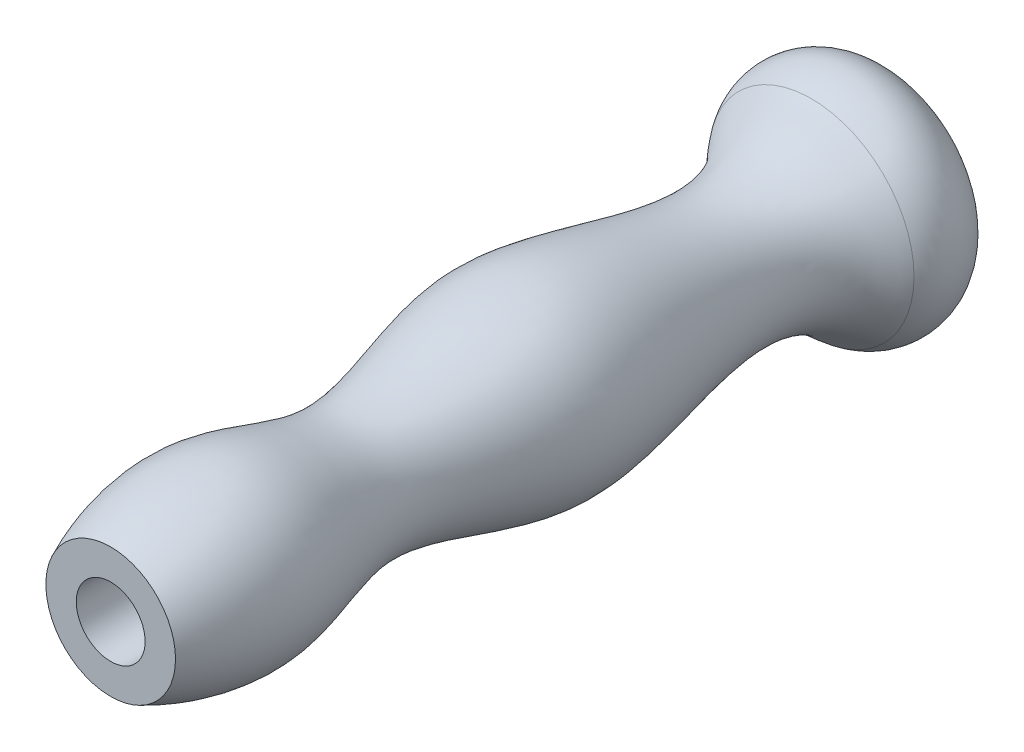
ISO-10303-21;
HEADER;
FILE_DESCRIPTION(('STEP AP214'),'2;1');
FILE_NAME('part.step','',(''),(''),'','','');
FILE_SCHEMA(('AUTOMOTIVE_DESIGN { 1 0 10303 214 1 1 1 1 }'));
ENDSEC;
DATA;
#1=APPLICATION_CONTEXT('core data for automotive mechanical design processes');
#2=APPLICATION_PROTOCOL_DEFINITION('international standard','automotive_design',2000,#1);
#3=PRODUCT_CONTEXT('',#1,'mechanical');
#4=PRODUCT('Part','Part','',(#3));
#5=PRODUCT_RELATED_PRODUCT_CATEGORY('part','',(#4));
#6=PRODUCT_DEFINITION_FORMATION('','',#4);
#7=PRODUCT_DEFINITION_CONTEXT('part definition',#1,'design');
#8=PRODUCT_DEFINITION('design','',#6,#7);
#9=PRODUCT_DEFINITION_SHAPE('','',#8);
#10=(LENGTH_UNIT() NAMED_UNIT(*) SI_UNIT(.MILLI.,.METRE.));
#11=(NAMED_UNIT(*) PLANE_ANGLE_UNIT() SI_UNIT($,.RADIAN.));
#12=(NAMED_UNIT(*) SI_UNIT($,.STERADIAN.) SOLID_ANGLE_UNIT());
#13=UNCERTAINTY_MEASURE_WITH_UNIT(LENGTH_MEASURE(1.E-05),#10,'distance_accuracy_value','');
#14=(GEOMETRIC_REPRESENTATION_CONTEXT(3) GLOBAL_UNCERTAINTY_ASSIGNED_CONTEXT((#13)) GLOBAL_UNIT_ASSIGNED_CONTEXT((#10,
#11,#12)) REPRESENTATION_CONTEXT('',''));
#15=CARTESIAN_POINT('',(0.,0.,0.));
#16=DIRECTION('',(0.,0.,1.));
#17=DIRECTION('',(1.,0.,0.));
#18=AXIS2_PLACEMENT_3D('',#15,#16,#17);
#19=CARTESIAN_POINT('',(0.,0.,-41.2952834358849));
#20=DIRECTION('',(0.,0.,1.));
#21=DIRECTION('',(1.,0.,0.));
#22=AXIS2_PLACEMENT_3D('',#19,#20,#21);
#23=PLANE('',#22);
#24=CARTESIAN_POINT('',(0.,0.,-41.2952834358849));
#25=DIRECTION('',(0.,0.,1.));
#26=DIRECTION('',(1.,0.,0.));
#27=AXIS2_PLACEMENT_3D('',#24,#25,#26);
#28=CIRCLE('',#27,4.25);
#29=CARTESIAN_POINT('',(4.25,0.,-41.2952834358849));
#30=VERTEX_POINT('',#29);
#31=EDGE_CURVE('E45',#30,#30,#28,.T.);
#32=ORIENTED_EDGE('',*,*,#31,.T.);
#33=EDGE_LOOP('',(#32));
#34=FACE_BOUND('',#33,.T.);
#35=CARTESIAN_POINT('',(0.,0.,-41.2952834358849));
#36=DIRECTION('',(0.,0.,1.));
#37=DIRECTION('',(1.,0.,0.));
#38=AXIS2_PLACEMENT_3D('',#35,#36,#37);
#39=CIRCLE('',#38,7.30923929650061);
#40=CARTESIAN_POINT('',(7.30923929650061,0.,-41.2952834358849));
#41=VERTEX_POINT('',#40);
#42=EDGE_CURVE('E10',#41,#41,#39,.T.);
#43=ORIENTED_EDGE('',*,*,#42,.F.);
#44=EDGE_LOOP('',(#43));
#45=FACE_BOUND('',#44,.T.);
#46=ADVANCED_FACE('F31',(#34,#45),#23,.F.);
#47=CARTESIAN_POINT('',(0.,0.,-34.6595428988323));
#48=DIRECTION('',(0.,0.,1.));
#49=DIRECTION('',(1.,0.,0.));
#50=AXIS2_PLACEMENT_3D('',#47,#48,#49);
#51=TOROIDAL_SURFACE('',#50,7.30923929650061,6.63574053705261);
#52=CARTESIAN_POINT('',(0.,0.,-30.7701209336347));
#53=DIRECTION('',(0.,0.,1.));
#54=DIRECTION('',(1.,0.,0.));
#55=AXIS2_PLACEMENT_3D('',#52,#53,#54);
#56=CIRCLE('',#55,12.6856181198092);
#57=CARTESIAN_POINT('',(12.6856181198092,0.,-30.7701209336347));
#58=VERTEX_POINT('',#57);
#59=EDGE_CURVE('E37',#58,#58,#56,.T.);
#60=ORIENTED_EDGE('',*,*,#59,.F.);
#61=EDGE_LOOP('',(#60));
#62=FACE_BOUND('',#61,.T.);
#63=ORIENTED_EDGE('',*,*,#42,.T.);
#64=EDGE_LOOP('',(#63));
#65=FACE_BOUND('',#64,.T.);
#66=ADVANCED_FACE('F61',(#62,#65),#51,.T.);
#67=CARTESIAN_POINT('',(0.,12.6856181198092,-30.7701209336347));
#68=CARTESIAN_POINT('',(0.,12.0644041143674,-29.9114118880528));
#69=CARTESIAN_POINT('',(0.,2.74504777688501,-20.9641001674676));
#70=CARTESIAN_POINT('',(0.,17.7679751464858,2.82919590562085));
#71=CARTESIAN_POINT('',(0.,5.12206338206462,23.7356243344153));
#72=CARTESIAN_POINT('',(0.,9.78985630221858,35.2800807409698));
#73=CARTESIAN_POINT('',(0.,11.5480303458427,44.6831585505505));
#74=CARTESIAN_POINT('',(0.,10.0681340770879,51.1837100619239));
#75=CARTESIAN_POINT('',(0.,8.,55.7047165641151));
#76=B_SPLINE_CURVE_WITH_KNOTS('',3,(#67,#68,#69,#70,#71,#72,#73,#74,#75),.UNSPECIFIED.,.F.,.F.,
(4,1,1,1,1,1,4),(0.,0.0341484933973956,0.401736856010709,0.638792661442344,0.744454874606749,
0.784537676117289,0.94649864019835),.UNSPECIFIED.);
#77=CARTESIAN_POINT('',(0.,0.,65.0811900703651));
#78=DIRECTION('',(0.,0.,1.));
#79=AXIS1_PLACEMENT('',#77,#78);
#80=SURFACE_OF_REVOLUTION('',#76,#79);
#81=CARTESIAN_POINT('',(0.,0.,55.7047165641151));
#82=DIRECTION('',(0.,0.,1.));
#83=DIRECTION('',(1.,0.,0.));
#84=AXIS2_PLACEMENT_3D('',#81,#82,#83);
#85=CIRCLE('',#84,8.);
#86=CARTESIAN_POINT('',(8.,0.,55.7047165641151));
#87=VERTEX_POINT('',#86);
#88=EDGE_CURVE('E41',#87,#87,#85,.T.);
#89=ORIENTED_EDGE('',*,*,#88,.F.);
#90=EDGE_LOOP('',(#89));
#91=FACE_BOUND('',#90,.T.);
#92=ORIENTED_EDGE('',*,*,#59,.T.);
#93=EDGE_LOOP('',(#92));
#94=FACE_BOUND('',#93,.T.);
#95=ADVANCED_FACE('F57',(#91,#94),#80,.T.);
#96=CARTESIAN_POINT('',(0.,0.,55.7047165641151));
#97=DIRECTION('',(0.,0.,-1.));
#98=DIRECTION('',(-1.,0.,0.));
#99=AXIS2_PLACEMENT_3D('',#96,#97,#98);
#100=PLANE('',#99);
#101=CARTESIAN_POINT('',(0.,0.,55.7047165641151));
#102=DIRECTION('',(0.,0.,1.));
#103=DIRECTION('',(1.,0.,0.));
#104=AXIS2_PLACEMENT_3D('',#101,#102,#103);
#105=CIRCLE('',#104,4.25);
#106=CARTESIAN_POINT('',(4.25,0.,55.7047165641151));
#107=VERTEX_POINT('',#106);
#108=EDGE_CURVE('E76',#107,#107,#105,.T.);
#109=ORIENTED_EDGE('',*,*,#108,.F.);
#110=EDGE_LOOP('',(#109));
#111=FACE_BOUND('',#110,.T.);
#112=ORIENTED_EDGE('',*,*,#88,.T.);
#113=EDGE_LOOP('',(#112));
#114=FACE_BOUND('',#113,.T.);
#115=ADVANCED_FACE('F60',(#111,#114),#100,.F.);
#116=CARTESIAN_POINT('',(0.,0.,-65.295283435885));
#117=DIRECTION('',(0.,0.,1.));
#118=DIRECTION('',(1.,0.,0.));
#119=AXIS2_PLACEMENT_3D('',#116,#117,#118);
#120=CYLINDRICAL_SURFACE('',#119,4.25);
#121=CARTESIAN_POINT('',(4.25,0.,55.7047165641151));
#122=CARTESIAN_POINT('',(4.25,0.,54.6942998974484));
#123=CARTESIAN_POINT('',(4.25,0.,53.6838832307818));
#124=CARTESIAN_POINT('',(4.25,0.,51.6630498974484));
#125=CARTESIAN_POINT('',(4.25,0.,50.6526332307818));
#126=CARTESIAN_POINT('',(4.25,0.,48.6317998974484));
#127=CARTESIAN_POINT('',(4.25,0.,47.6213832307818));
#128=CARTESIAN_POINT('',(4.25,0.,45.6005498974484));
#129=CARTESIAN_POINT('',(4.25,0.,44.5901332307818));
#130=CARTESIAN_POINT('',(4.25,0.,42.5692998974484));
#131=CARTESIAN_POINT('',(4.25,0.,41.5588832307818));
#132=CARTESIAN_POINT('',(4.25,0.,39.5380498974484));
#133=CARTESIAN_POINT('',(4.25,0.,38.5276332307818));
#134=CARTESIAN_POINT('',(4.25,0.,36.5067998974484));
#135=CARTESIAN_POINT('',(4.25,0.,35.4963832307818));
#136=CARTESIAN_POINT('',(4.25,0.,33.4755498974484));
#137=CARTESIAN_POINT('',(4.25,0.,32.4651332307818));
#138=CARTESIAN_POINT('',(4.25,0.,30.4442998974484));
#139=CARTESIAN_POINT('',(4.25,0.,29.4338832307818));
#140=CARTESIAN_POINT('',(4.25,0.,27.4130498974484));
#141=CARTESIAN_POINT('',(4.25,0.,26.4026332307818));
#142=CARTESIAN_POINT('',(4.25,0.,24.3817998974484));
#143=CARTESIAN_POINT('',(4.25,0.,23.3713832307818));
#144=CARTESIAN_POINT('',(4.25,0.,21.3505498974484));
#145=CARTESIAN_POINT('',(4.25,0.,20.3401332307818));
#146=CARTESIAN_POINT('',(4.25,0.,18.3192998974484));
#147=CARTESIAN_POINT('',(4.25,0.,17.3088832307818));
#148=CARTESIAN_POINT('',(4.25,0.,15.2880498974484));
#149=CARTESIAN_POINT('',(4.25,0.,14.2776332307818));
#150=CARTESIAN_POINT('',(4.25,0.,12.2567998974484));
#151=CARTESIAN_POINT('',(4.25,0.,11.2463832307818));
#152=CARTESIAN_POINT('',(4.25,0.,9.22554989744842));
#153=CARTESIAN_POINT('',(4.25,0.,8.21513323078175));
#154=CARTESIAN_POINT('',(4.25,0.,6.19429989744842));
#155=CARTESIAN_POINT('',(4.25,0.,5.18388323078176));
#156=CARTESIAN_POINT('',(4.25,0.,3.16304989744842));
#157=CARTESIAN_POINT('',(4.25,0.,2.15263323078176));
#158=CARTESIAN_POINT('',(4.25,0.,0.131799897448423));
#159=CARTESIAN_POINT('',(4.25,0.,-0.878616769218243));
#160=CARTESIAN_POINT('',(4.25,0.,-2.89945010255157));
#161=CARTESIAN_POINT('',(4.25,0.,-3.90986676921824));
#162=CARTESIAN_POINT('',(4.25,0.,-5.93070010255157));
#163=CARTESIAN_POINT('',(4.25,0.,-6.94111676921823));
#164=CARTESIAN_POINT('',(4.25,0.,-8.96195010255157));
#165=CARTESIAN_POINT('',(4.25,0.,-9.97236676921823));
#166=CARTESIAN_POINT('',(4.25,0.,-11.9932001025516));
#167=CARTESIAN_POINT('',(4.25,0.,-13.0036167692182));
#168=CARTESIAN_POINT('',(4.25,0.,-15.0244501025516));
#169=CARTESIAN_POINT('',(4.25,0.,-16.0348667692182));
#170=CARTESIAN_POINT('',(4.25,0.,-18.0557001025516));
#171=CARTESIAN_POINT('',(4.25,0.,-19.0661167692182));
#172=CARTESIAN_POINT('',(4.25,0.,-21.0869501025516));
#173=CARTESIAN_POINT('',(4.25,0.,-22.0973667692182));
#174=CARTESIAN_POINT('',(4.25,0.,-24.1182001025516));
#175=CARTESIAN_POINT('',(4.25,0.,-25.1286167692182));
#176=CARTESIAN_POINT('',(4.25,0.,-27.1494501025516));
#177=CARTESIAN_POINT('',(4.25,0.,-28.1598667692182));
#178=CARTESIAN_POINT('',(4.25,0.,-30.1807001025516));
#179=CARTESIAN_POINT('',(4.25,0.,-31.1911167692182));
#180=CARTESIAN_POINT('',(4.25,0.,-33.2119501025516));
#181=CARTESIAN_POINT('',(4.25,0.,-34.2223667692182));
#182=CARTESIAN_POINT('',(4.25,0.,-36.2432001025516));
#183=CARTESIAN_POINT('',(4.25,0.,-37.2536167692182));
#184=CARTESIAN_POINT('',(4.25,0.,-39.2744501025516));
#185=CARTESIAN_POINT('',(4.25,0.,-40.2848667692182));
#186=CARTESIAN_POINT('',(4.25,0.,-41.2952834358849));
#187=B_SPLINE_CURVE_WITH_KNOTS('',3,(#121,#122,#123,#124,#125,#126,#127,#128,#129,#130,#131,
#132,#133,#134,#135,#136,#137,#138,#139,#140,#141,#142,#143,#144,#145,#146,#147,#148,#149,#150,
#151,#152,#153,#154,#155,#156,#157,#158,#159,#160,#161,#162,#163,#164,#165,#166,#167,#168,#169,
#170,#171,#172,#173,#174,#175,#176,#177,#178,#179,#180,#181,#182,#183,#184,#185,#186),
.UNSPECIFIED.,.F.,.F.,(4,2,2,2,2,2,2,2,2,2,2,2,2,2,2,2,2,2,2,2,2,2,2,2,2,2,2,2,2,2,2,2,4),(0.,
3.03125,6.0625,9.09375,12.125,15.15625,18.1875,21.21875,24.25,27.28125,30.3125,33.34375,36.375,
39.40625,42.4375,45.46875,48.5,51.53125,54.5625,57.59375,60.625,63.65625,66.6875,69.71875,72.75,
75.78125,78.8125,81.84375,84.875,87.90625,90.9375,93.96875,97.),.UNSPECIFIED.);
#188=EDGE_CURVE('BSEAM80',#107,#30,#187,.T.);
#189=ORIENTED_EDGE('',*,*,#108,.T.);
#190=ORIENTED_EDGE('',*,*,#31,.F.);
#191=ORIENTED_EDGE('',*,*,#188,.T.);
#192=ORIENTED_EDGE('',*,*,#188,.F.);
#193=EDGE_LOOP('',(#189,#191,#190,#192));
#194=FACE_BOUND('',#193,.T.);
#195=ADVANCED_FACE('F80',(#194),#120,.F.);
#196=CLOSED_SHELL('',(#46,#66,#95,#115,#195));
#197=MANIFOLD_SOLID_BREP('B2',#196);
#198=ADVANCED_BREP_SHAPE_REPRESENTATION('',(#18,#197),#14);
#199=SHAPE_DEFINITION_REPRESENTATION(#9,#198);
ENDSEC;
END-ISO-10303-21;
